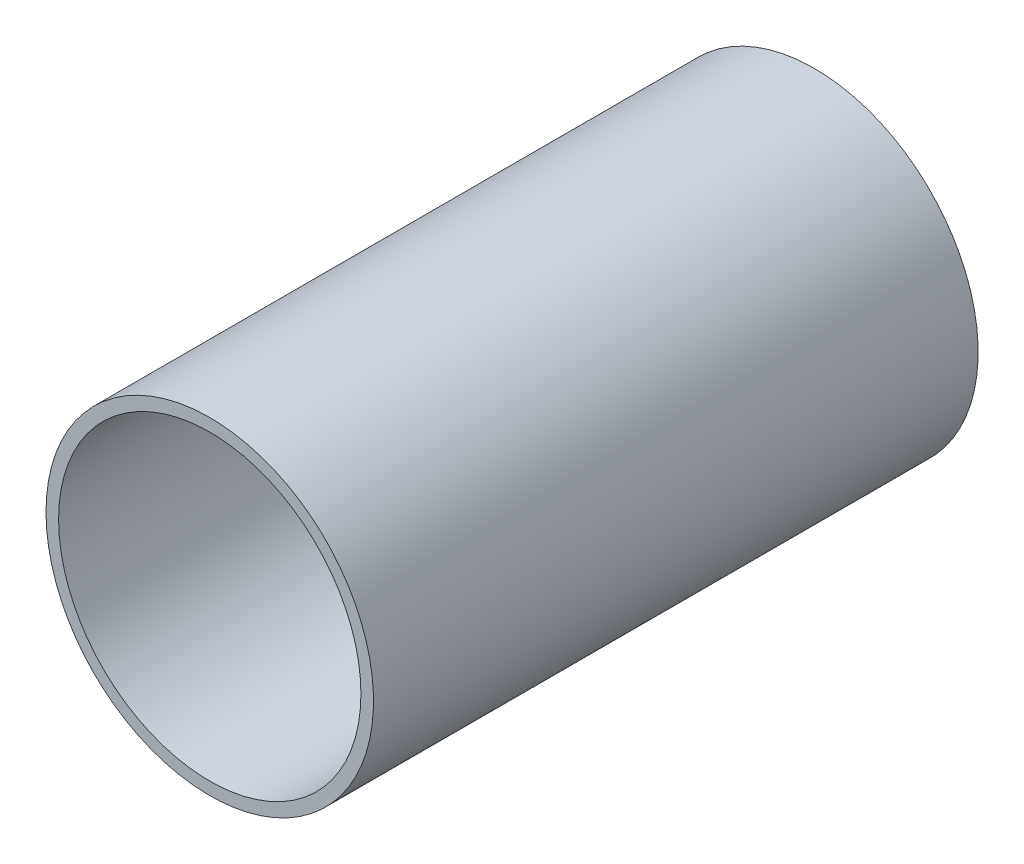
ISO-10303-21;
HEADER;
FILE_DESCRIPTION(('STEP AP214'),'2;1');
FILE_NAME('part.step','',(''),(''),'','','');
FILE_SCHEMA(('AUTOMOTIVE_DESIGN { 1 0 10303 214 1 1 1 1 }'));
ENDSEC;
DATA;
#1=APPLICATION_CONTEXT('core data for automotive mechanical design processes');
#2=APPLICATION_PROTOCOL_DEFINITION('international standard','automotive_design',2000,#1);
#3=PRODUCT_CONTEXT('',#1,'mechanical');
#4=PRODUCT('Part','Part','',(#3));
#5=PRODUCT_RELATED_PRODUCT_CATEGORY('part','',(#4));
#6=PRODUCT_DEFINITION_FORMATION('','',#4);
#7=PRODUCT_DEFINITION_CONTEXT('part definition',#1,'design');
#8=PRODUCT_DEFINITION('design','',#6,#7);
#9=PRODUCT_DEFINITION_SHAPE('','',#8);
#10=(LENGTH_UNIT() NAMED_UNIT(*) SI_UNIT(.MILLI.,.METRE.));
#11=(NAMED_UNIT(*) PLANE_ANGLE_UNIT() SI_UNIT($,.RADIAN.));
#12=(NAMED_UNIT(*) SI_UNIT($,.STERADIAN.) SOLID_ANGLE_UNIT());
#13=UNCERTAINTY_MEASURE_WITH_UNIT(LENGTH_MEASURE(1.E-05),#10,'distance_accuracy_value','');
#14=(GEOMETRIC_REPRESENTATION_CONTEXT(3) GLOBAL_UNCERTAINTY_ASSIGNED_CONTEXT((#13)) GLOBAL_UNIT_ASSIGNED_CONTEXT((#10,
#11,#12)) REPRESENTATION_CONTEXT('',''));
#15=CARTESIAN_POINT('',(0.,0.,0.));
#16=DIRECTION('',(0.,0.,1.));
#17=DIRECTION('',(1.,0.,0.));
#18=AXIS2_PLACEMENT_3D('',#15,#16,#17);
#19=CARTESIAN_POINT('',(0.,0.,152.4));
#20=DIRECTION('',(0.,0.,1.));
#21=DIRECTION('',(1.,0.,0.));
#22=AXIS2_PLACEMENT_3D('',#19,#20,#21);
#23=PLANE('',#22);
#24=CARTESIAN_POINT('',(0.,0.,152.4));
#25=DIRECTION('',(0.,0.,1.));
#26=DIRECTION('',(1.,0.,0.));
#27=AXIS2_PLACEMENT_3D('',#24,#25,#26);
#28=CIRCLE('',#27,82.55);
#29=CARTESIAN_POINT('',(-82.55,0.,152.4));
#30=VERTEX_POINT('',#29);
#31=EDGE_CURVE('E11',#30,#30,#28,.T.);
#32=ORIENTED_EDGE('',*,*,#31,.T.);
#33=EDGE_LOOP('',(#32));
#34=FACE_BOUND('',#33,.T.);
#35=CARTESIAN_POINT('',(0.,0.,152.4));
#36=DIRECTION('',(0.,0.,1.));
#37=DIRECTION('',(1.,0.,0.));
#38=AXIS2_PLACEMENT_3D('',#35,#36,#37);
#39=CIRCLE('',#38,76.2);
#40=CARTESIAN_POINT('',(-76.2,0.,152.4));
#41=VERTEX_POINT('',#40);
#42=EDGE_CURVE('E48',#41,#41,#39,.T.);
#43=ORIENTED_EDGE('',*,*,#42,.F.);
#44=EDGE_LOOP('',(#43));
#45=FACE_BOUND('',#44,.T.);
#46=ADVANCED_FACE('F37',(#34,#45),#23,.T.);
#47=CARTESIAN_POINT('',(0.,0.,-152.4));
#48=DIRECTION('',(0.,0.,1.));
#49=DIRECTION('',(1.,0.,0.));
#50=AXIS2_PLACEMENT_3D('',#47,#48,#49);
#51=PLANE('',#50);
#52=CARTESIAN_POINT('',(0.,0.,-152.4));
#53=DIRECTION('',(0.,0.,1.));
#54=DIRECTION('',(1.,0.,0.));
#55=AXIS2_PLACEMENT_3D('',#52,#53,#54);
#56=CIRCLE('',#55,82.55);
#57=CARTESIAN_POINT('',(-82.55,0.,-152.4));
#58=VERTEX_POINT('',#57);
#59=EDGE_CURVE('E41',#58,#58,#56,.T.);
#60=ORIENTED_EDGE('',*,*,#59,.F.);
#61=EDGE_LOOP('',(#60));
#62=FACE_BOUND('',#61,.T.);
#63=CARTESIAN_POINT('',(0.,0.,-152.4));
#64=DIRECTION('',(0.,0.,1.));
#65=DIRECTION('',(1.,0.,0.));
#66=AXIS2_PLACEMENT_3D('',#63,#64,#65);
#67=CIRCLE('',#66,76.2);
#68=CARTESIAN_POINT('',(-76.2,0.,-152.4));
#69=VERTEX_POINT('',#68);
#70=EDGE_CURVE('E50',#69,#69,#67,.T.);
#71=ORIENTED_EDGE('',*,*,#70,.T.);
#72=EDGE_LOOP('',(#71));
#73=FACE_BOUND('',#72,.T.);
#74=ADVANCED_FACE('F60',(#62,#73),#51,.F.);
#75=CARTESIAN_POINT('',(0.,0.,152.4));
#76=DIRECTION('',(0.,0.,-1.));
#77=DIRECTION('',(-1.,0.,0.));
#78=AXIS2_PLACEMENT_3D('',#75,#76,#77);
#79=CYLINDRICAL_SURFACE('',#78,82.55);
#80=CARTESIAN_POINT('',(-82.55,0.,152.4));
#81=CARTESIAN_POINT('',(-82.55,0.,149.225));
#82=CARTESIAN_POINT('',(-82.55,0.,146.05));
#83=CARTESIAN_POINT('',(-82.55,0.,139.7));
#84=CARTESIAN_POINT('',(-82.55,0.,136.525));
#85=CARTESIAN_POINT('',(-82.55,0.,130.175));
#86=CARTESIAN_POINT('',(-82.55,0.,127.));
#87=CARTESIAN_POINT('',(-82.55,0.,120.65));
#88=CARTESIAN_POINT('',(-82.55,0.,117.475));
#89=CARTESIAN_POINT('',(-82.55,0.,111.125));
#90=CARTESIAN_POINT('',(-82.55,0.,107.95));
#91=CARTESIAN_POINT('',(-82.55,0.,101.6));
#92=CARTESIAN_POINT('',(-82.55,0.,98.425));
#93=CARTESIAN_POINT('',(-82.55,0.,92.075));
#94=CARTESIAN_POINT('',(-82.55,0.,88.9));
#95=CARTESIAN_POINT('',(-82.55,0.,82.55));
#96=CARTESIAN_POINT('',(-82.55,0.,79.375));
#97=CARTESIAN_POINT('',(-82.55,0.,73.025));
#98=CARTESIAN_POINT('',(-82.55,0.,69.85));
#99=CARTESIAN_POINT('',(-82.55,0.,63.5));
#100=CARTESIAN_POINT('',(-82.55,0.,60.325));
#101=CARTESIAN_POINT('',(-82.55,0.,53.975));
#102=CARTESIAN_POINT('',(-82.55,0.,50.8));
#103=CARTESIAN_POINT('',(-82.55,0.,44.45));
#104=CARTESIAN_POINT('',(-82.55,0.,41.275));
#105=CARTESIAN_POINT('',(-82.55,0.,34.925));
#106=CARTESIAN_POINT('',(-82.55,0.,31.75));
#107=CARTESIAN_POINT('',(-82.55,0.,25.4));
#108=CARTESIAN_POINT('',(-82.55,0.,22.225));
#109=CARTESIAN_POINT('',(-82.55,0.,15.875));
#110=CARTESIAN_POINT('',(-82.55,0.,12.7));
#111=CARTESIAN_POINT('',(-82.55,0.,6.35));
#112=CARTESIAN_POINT('',(-82.55,0.,3.175));
#113=CARTESIAN_POINT('',(-82.55,0.,-3.175));
#114=CARTESIAN_POINT('',(-82.55,0.,-6.35));
#115=CARTESIAN_POINT('',(-82.55,0.,-12.7));
#116=CARTESIAN_POINT('',(-82.55,0.,-15.875));
#117=CARTESIAN_POINT('',(-82.55,0.,-22.225));
#118=CARTESIAN_POINT('',(-82.55,0.,-25.4));
#119=CARTESIAN_POINT('',(-82.55,0.,-31.75));
#120=CARTESIAN_POINT('',(-82.55,0.,-34.925));
#121=CARTESIAN_POINT('',(-82.55,0.,-41.275));
#122=CARTESIAN_POINT('',(-82.55,0.,-44.45));
#123=CARTESIAN_POINT('',(-82.55,0.,-50.8));
#124=CARTESIAN_POINT('',(-82.55,0.,-53.975));
#125=CARTESIAN_POINT('',(-82.55,0.,-60.325));
#126=CARTESIAN_POINT('',(-82.55,0.,-63.5));
#127=CARTESIAN_POINT('',(-82.55,0.,-69.85));
#128=CARTESIAN_POINT('',(-82.55,0.,-73.025));
#129=CARTESIAN_POINT('',(-82.55,0.,-79.375));
#130=CARTESIAN_POINT('',(-82.55,0.,-82.55));
#131=CARTESIAN_POINT('',(-82.55,0.,-88.9));
#132=CARTESIAN_POINT('',(-82.55,0.,-92.075));
#133=CARTESIAN_POINT('',(-82.55,0.,-98.425));
#134=CARTESIAN_POINT('',(-82.55,0.,-101.6));
#135=CARTESIAN_POINT('',(-82.55,0.,-107.95));
#136=CARTESIAN_POINT('',(-82.55,0.,-111.125));
#137=CARTESIAN_POINT('',(-82.55,0.,-117.475));
#138=CARTESIAN_POINT('',(-82.55,0.,-120.65));
#139=CARTESIAN_POINT('',(-82.55,0.,-127.));
#140=CARTESIAN_POINT('',(-82.55,0.,-130.175));
#141=CARTESIAN_POINT('',(-82.55,0.,-136.525));
#142=CARTESIAN_POINT('',(-82.55,0.,-139.7));
#143=CARTESIAN_POINT('',(-82.55,0.,-146.05));
#144=CARTESIAN_POINT('',(-82.55,0.,-149.225));
#145=CARTESIAN_POINT('',(-82.55,0.,-152.4));
#146=B_SPLINE_CURVE_WITH_KNOTS('',3,(#80,#81,#82,#83,#84,#85,#86,#87,#88,#89,#90,#91,#92,#93,
#94,#95,#96,#97,#98,#99,#100,#101,#102,#103,#104,#105,#106,#107,#108,#109,#110,#111,#112,#113,
#114,#115,#116,#117,#118,#119,#120,#121,#122,#123,#124,#125,#126,#127,#128,#129,#130,#131,#132,
#133,#134,#135,#136,#137,#138,#139,#140,#141,#142,#143,#144,#145),.UNSPECIFIED.,.F.,.F.,(4,2,2,
2,2,2,2,2,2,2,2,2,2,2,2,2,2,2,2,2,2,2,2,2,2,2,2,2,2,2,2,2,4),(0.,9.52500000000001,19.05,28.575,
38.1,47.625,57.15,66.675,76.2,85.725,95.25,104.775,114.3,123.825,133.35,142.875,152.4,161.925,
171.45,180.975,190.5,200.025,209.55,219.075,228.6,238.125,247.65,257.175,266.7,276.225,285.75,
295.275,304.8),.UNSPECIFIED.);
#147=EDGE_CURVE('BSEAM39',#30,#58,#146,.T.);
#148=ORIENTED_EDGE('',*,*,#31,.F.);
#149=ORIENTED_EDGE('',*,*,#59,.T.);
#150=ORIENTED_EDGE('',*,*,#147,.T.);
#151=ORIENTED_EDGE('',*,*,#147,.F.);
#152=EDGE_LOOP('',(#148,#150,#149,#151));
#153=FACE_BOUND('',#152,.T.);
#154=ADVANCED_FACE('F39',(#153),#79,.T.);
#155=CARTESIAN_POINT('',(0.,0.,152.4));
#156=DIRECTION('',(0.,0.,-1.));
#157=DIRECTION('',(-1.,0.,0.));
#158=AXIS2_PLACEMENT_3D('',#155,#156,#157);
#159=CYLINDRICAL_SURFACE('',#158,76.2);
#160=CARTESIAN_POINT('',(-76.2,0.,152.4));
#161=CARTESIAN_POINT('',(-76.2,0.,149.225));
#162=CARTESIAN_POINT('',(-76.2,0.,146.05));
#163=CARTESIAN_POINT('',(-76.2,0.,139.7));
#164=CARTESIAN_POINT('',(-76.2,0.,136.525));
#165=CARTESIAN_POINT('',(-76.2,0.,130.175));
#166=CARTESIAN_POINT('',(-76.2,0.,127.));
#167=CARTESIAN_POINT('',(-76.2,0.,120.65));
#168=CARTESIAN_POINT('',(-76.2,0.,117.475));
#169=CARTESIAN_POINT('',(-76.2,0.,111.125));
#170=CARTESIAN_POINT('',(-76.2,0.,107.95));
#171=CARTESIAN_POINT('',(-76.2,0.,101.6));
#172=CARTESIAN_POINT('',(-76.2,0.,98.425));
#173=CARTESIAN_POINT('',(-76.2,0.,92.075));
#174=CARTESIAN_POINT('',(-76.2,0.,88.9));
#175=CARTESIAN_POINT('',(-76.2,0.,82.55));
#176=CARTESIAN_POINT('',(-76.2,0.,79.375));
#177=CARTESIAN_POINT('',(-76.2,0.,73.025));
#178=CARTESIAN_POINT('',(-76.2,0.,69.85));
#179=CARTESIAN_POINT('',(-76.2,0.,63.5));
#180=CARTESIAN_POINT('',(-76.2,0.,60.325));
#181=CARTESIAN_POINT('',(-76.2,0.,53.975));
#182=CARTESIAN_POINT('',(-76.2,0.,50.8));
#183=CARTESIAN_POINT('',(-76.2,0.,44.45));
#184=CARTESIAN_POINT('',(-76.2,0.,41.275));
#185=CARTESIAN_POINT('',(-76.2,0.,34.925));
#186=CARTESIAN_POINT('',(-76.2,0.,31.75));
#187=CARTESIAN_POINT('',(-76.2,0.,25.4));
#188=CARTESIAN_POINT('',(-76.2,0.,22.225));
#189=CARTESIAN_POINT('',(-76.2,0.,15.875));
#190=CARTESIAN_POINT('',(-76.2,0.,12.7));
#191=CARTESIAN_POINT('',(-76.2,0.,6.35));
#192=CARTESIAN_POINT('',(-76.2,0.,3.175));
#193=CARTESIAN_POINT('',(-76.2,0.,-3.175));
#194=CARTESIAN_POINT('',(-76.2,0.,-6.35));
#195=CARTESIAN_POINT('',(-76.2,0.,-12.7));
#196=CARTESIAN_POINT('',(-76.2,0.,-15.875));
#197=CARTESIAN_POINT('',(-76.2,0.,-22.225));
#198=CARTESIAN_POINT('',(-76.2,0.,-25.4));
#199=CARTESIAN_POINT('',(-76.2,0.,-31.75));
#200=CARTESIAN_POINT('',(-76.2,0.,-34.925));
#201=CARTESIAN_POINT('',(-76.2,0.,-41.275));
#202=CARTESIAN_POINT('',(-76.2,0.,-44.45));
#203=CARTESIAN_POINT('',(-76.2,0.,-50.8));
#204=CARTESIAN_POINT('',(-76.2,0.,-53.975));
#205=CARTESIAN_POINT('',(-76.2,0.,-60.325));
#206=CARTESIAN_POINT('',(-76.2,0.,-63.5));
#207=CARTESIAN_POINT('',(-76.2,0.,-69.85));
#208=CARTESIAN_POINT('',(-76.2,0.,-73.025));
#209=CARTESIAN_POINT('',(-76.2,0.,-79.375));
#210=CARTESIAN_POINT('',(-76.2,0.,-82.55));
#211=CARTESIAN_POINT('',(-76.2,0.,-88.9));
#212=CARTESIAN_POINT('',(-76.2,0.,-92.075));
#213=CARTESIAN_POINT('',(-76.2,0.,-98.425));
#214=CARTESIAN_POINT('',(-76.2,0.,-101.6));
#215=CARTESIAN_POINT('',(-76.2,0.,-107.95));
#216=CARTESIAN_POINT('',(-76.2,0.,-111.125));
#217=CARTESIAN_POINT('',(-76.2,0.,-117.475));
#218=CARTESIAN_POINT('',(-76.2,0.,-120.65));
#219=CARTESIAN_POINT('',(-76.2,0.,-127.));
#220=CARTESIAN_POINT('',(-76.2,0.,-130.175));
#221=CARTESIAN_POINT('',(-76.2,0.,-136.525));
#222=CARTESIAN_POINT('',(-76.2,0.,-139.7));
#223=CARTESIAN_POINT('',(-76.2,0.,-146.05));
#224=CARTESIAN_POINT('',(-76.2,0.,-149.225));
#225=CARTESIAN_POINT('',(-76.2,0.,-152.4));
#226=B_SPLINE_CURVE_WITH_KNOTS('',3,(#160,#161,#162,#163,#164,#165,#166,#167,#168,#169,#170,
#171,#172,#173,#174,#175,#176,#177,#178,#179,#180,#181,#182,#183,#184,#185,#186,#187,#188,#189,
#190,#191,#192,#193,#194,#195,#196,#197,#198,#199,#200,#201,#202,#203,#204,#205,#206,#207,#208,
#209,#210,#211,#212,#213,#214,#215,#216,#217,#218,#219,#220,#221,#222,#223,#224,#225),
.UNSPECIFIED.,.F.,.F.,(4,2,2,2,2,2,2,2,2,2,2,2,2,2,2,2,2,2,2,2,2,2,2,2,2,2,2,2,2,2,2,2,4),(0.,
9.52500000000001,19.05,28.575,38.1,47.625,57.15,66.675,76.2,85.725,95.25,104.775,114.3,123.825,
133.35,142.875,152.4,161.925,171.45,180.975,190.5,200.025,209.55,219.075,228.6,238.125,247.65,
257.175,266.7,276.225,285.75,295.275,304.8),.UNSPECIFIED.);
#227=EDGE_CURVE('BSEAM56',#41,#69,#226,.T.);
#228=ORIENTED_EDGE('',*,*,#42,.T.);
#229=ORIENTED_EDGE('',*,*,#70,.F.);
#230=ORIENTED_EDGE('',*,*,#227,.T.);
#231=ORIENTED_EDGE('',*,*,#227,.F.);
#232=EDGE_LOOP('',(#228,#230,#229,#231));
#233=FACE_BOUND('',#232,.T.);
#234=ADVANCED_FACE('F56',(#233),#159,.F.);
#235=CLOSED_SHELL('',(#46,#74,#154,#234));
#236=MANIFOLD_SOLID_BREP('B2',#235);
#237=ADVANCED_BREP_SHAPE_REPRESENTATION('',(#18,#236),#14);
#238=SHAPE_DEFINITION_REPRESENTATION(#9,#237);
ENDSEC;
END-ISO-10303-21;
